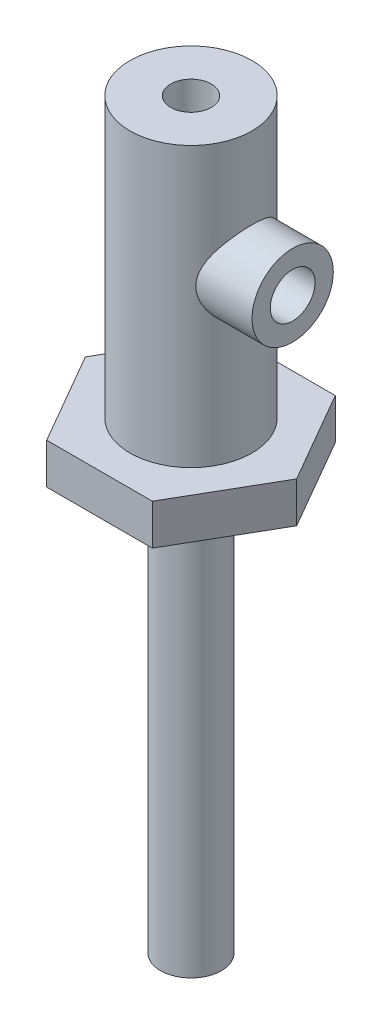
ISO-10303-21;
HEADER;
FILE_DESCRIPTION(('STEP AP214'),'2;1');
FILE_NAME('part.step','',(''),(''),'','','');
FILE_SCHEMA(('AUTOMOTIVE_DESIGN { 1 0 10303 214 1 1 1 1 }'));
ENDSEC;
DATA;
#1=APPLICATION_CONTEXT('core data for automotive mechanical design processes');
#2=APPLICATION_PROTOCOL_DEFINITION('international standard','automotive_design',2000,#1);
#3=PRODUCT_CONTEXT('',#1,'mechanical');
#4=PRODUCT('Part','Part','',(#3));
#5=PRODUCT_RELATED_PRODUCT_CATEGORY('part','',(#4));
#6=PRODUCT_DEFINITION_FORMATION('','',#4);
#7=PRODUCT_DEFINITION_CONTEXT('part definition',#1,'design');
#8=PRODUCT_DEFINITION('design','',#6,#7);
#9=PRODUCT_DEFINITION_SHAPE('','',#8);
#10=(LENGTH_UNIT() NAMED_UNIT(*) SI_UNIT(.MILLI.,.METRE.));
#11=(NAMED_UNIT(*) PLANE_ANGLE_UNIT() SI_UNIT($,.RADIAN.));
#12=(NAMED_UNIT(*) SI_UNIT($,.STERADIAN.) SOLID_ANGLE_UNIT());
#13=UNCERTAINTY_MEASURE_WITH_UNIT(LENGTH_MEASURE(1.E-05),#10,'distance_accuracy_value','');
#14=(GEOMETRIC_REPRESENTATION_CONTEXT(3) GLOBAL_UNCERTAINTY_ASSIGNED_CONTEXT((#13)) GLOBAL_UNIT_ASSIGNED_CONTEXT((#10,
#11,#12)) REPRESENTATION_CONTEXT('',''));
#15=CARTESIAN_POINT('',(0.,0.,0.));
#16=DIRECTION('',(0.,0.,1.));
#17=DIRECTION('',(1.,0.,0.));
#18=AXIS2_PLACEMENT_3D('',#15,#16,#17);
#19=CARTESIAN_POINT('',(0.,5.525,0.));
#20=DIRECTION('',(0.,1.,0.));
#21=DIRECTION('',(0.,0.,1.));
#22=AXIS2_PLACEMENT_3D('',#19,#20,#21);
#23=CYLINDRICAL_SURFACE('',#22,1.);
#24=CARTESIAN_POINT('',(0.,15.725,0.));
#25=DIRECTION('',(0.,1.,0.));
#26=DIRECTION('',(0.,0.,1.));
#27=AXIS2_PLACEMENT_3D('',#24,#25,#26);
#28=CIRCLE('',#27,1.);
#29=CARTESIAN_POINT('',(0.,15.725,1.));
#30=VERTEX_POINT('',#29);
#31=EDGE_CURVE('E170',#30,#30,#28,.T.);
#32=ORIENTED_EDGE('',*,*,#31,.T.);
#33=EDGE_LOOP('',(#32));
#34=FACE_BOUND('',#33,.T.);
#35=CARTESIAN_POINT('',(0.,5.525,0.));
#36=DIRECTION('',(0.,1.,0.));
#37=DIRECTION('',(0.,0.,1.));
#38=AXIS2_PLACEMENT_3D('',#35,#36,#37);
#39=CIRCLE('',#38,1.);
#40=CARTESIAN_POINT('',(0.,5.525,1.));
#41=VERTEX_POINT('',#40);
#42=EDGE_CURVE('E180',#41,#41,#39,.T.);
#43=ORIENTED_EDGE('',*,*,#42,.F.);
#44=EDGE_LOOP('',(#43));
#45=FACE_BOUND('',#44,.T.);
#46=DIRECTION('',(0.,1.,0.));
#47=VECTOR('',#46,1.);
#48=CARTESIAN_POINT('',(0.,5.525,-1.));
#49=LINE('',#48,#47);
#50=CARTESIAN_POINT('',(0.,10.1832575694956,-1.));
#51=VERTEX_POINT('',#50);
#52=CARTESIAN_POINT('',(0.,9.26674243050442,-1.));
#53=VERTEX_POINT('',#52);
#54=EDGE_CURVE('E11',#51,#53,#49,.F.);
#55=ORIENTED_EDGE('',*,*,#54,.F.);
#56=CARTESIAN_POINT('',(0.,10.1832575694956,-1.));
#57=CARTESIAN_POINT('',(0.0296201730521179,10.1831194419498,-1.00002996136619));
#58=CARTESIAN_POINT('',(0.0589749676990003,10.1861338633212,-0.99868732555389));
#59=CARTESIAN_POINT('',(0.116029285837842,10.1969389571791,-0.993641594933778));
#60=CARTESIAN_POINT('',(0.143749854801669,10.2046360138594,-0.989984710596634));
#61=CARTESIAN_POINT('',(0.21130907429664,10.2281546341324,-0.978298768916381));
#62=CARTESIAN_POINT('',(0.250132310892404,10.2461174400268,-0.968991638472719));
#63=CARTESIAN_POINT('',(0.324994392397176,10.2859041876652,-0.946531644316044));
#64=CARTESIAN_POINT('',(0.360995183033686,10.3077709969598,-0.933334900145696));
#65=CARTESIAN_POINT('',(0.426224607958811,10.3504109495733,-0.905226101100838));
#66=CARTESIAN_POINT('',(0.455747289954067,10.3710000073665,-0.890710437589105));
#67=CARTESIAN_POINT('',(0.513011709604824,10.4126018846491,-0.859005540690853));
#68=CARTESIAN_POINT('',(0.540752267615861,10.4336149729696,-0.84181456167265));
#69=CARTESIAN_POINT('',(0.621237078070059,10.496223662425,-0.786324518024733));
#70=CARTESIAN_POINT('',(0.671515129670791,10.5375790042774,-0.743990874288796));
#71=CARTESIAN_POINT('',(0.752879484416972,10.6061888291838,-0.660065937850455));
#72=CARTESIAN_POINT('',(0.785640051760052,10.6344046523304,-0.620869308529475));
#73=CARTESIAN_POINT('',(0.845746157339784,10.6868037750584,-0.536100466077223));
#74=CARTESIAN_POINT('',(0.873098953085571,10.7109924722677,-0.49053693984766));
#75=CARTESIAN_POINT('',(0.916170153682461,10.7493503677566,-0.403125341022513));
#76=CARTESIAN_POINT('',(0.933120657535419,10.7645555776252,-0.362343284324251));
#77=CARTESIAN_POINT('',(0.961745542419179,10.7903239714841,-0.277564592099852));
#78=CARTESIAN_POINT('',(0.973423413521915,10.8008902259731,-0.23357010542594));
#79=CARTESIAN_POINT('',(0.990776475957356,10.8166155306831,-0.143151077309976));
#80=CARTESIAN_POINT('',(0.996413409257956,10.8217401162732,-0.0967129794800645));
#81=CARTESIAN_POINT('',(1.00108763494418,10.8259883523368,-0.00323490952425844));
#82=CARTESIAN_POINT('',(1.00012736092908,10.8251142156386,0.0438048342738349));
#83=CARTESIAN_POINT('',(0.992132957980567,10.8178520574469,0.132037237698455));
#84=CARTESIAN_POINT('',(0.985727011445585,10.8120343287992,0.173337698440637));
#85=CARTESIAN_POINT('',(0.96808341495657,10.7960609384214,0.254008552341759));
#86=CARTESIAN_POINT('',(0.956844836815365,10.7859044433616,0.293378573108546));
#87=CARTESIAN_POINT('',(0.929467726954121,10.7612781856954,0.37132366876728));
#88=CARTESIAN_POINT('',(0.913113207059213,10.7466189483322,0.409761712376257));
#89=CARTESIAN_POINT('',(0.876478928518945,10.7140127960909,0.483188449254017));
#90=CARTESIAN_POINT('',(0.856197571454796,10.6960645425787,0.518175729106231));
#91=CARTESIAN_POINT('',(0.800807900114322,10.6475121495769,0.601990334947999));
#92=CARTESIAN_POINT('',(0.763515519731663,10.6152202587814,0.64840487431778));
#93=CARTESIAN_POINT('',(0.682928749831262,10.5471468227738,0.732826125183259));
#94=CARTESIAN_POINT('',(0.63961467899611,10.5113539535413,0.770804160026089));
#95=CARTESIAN_POINT('',(0.546687138885316,10.4377491266718,0.839379168685292));
#96=CARTESIAN_POINT('',(0.496946573123861,10.3999092676383,0.869775240989043));
#97=CARTESIAN_POINT('',(0.417992944968771,10.3449779855255,0.90892143257758));
#98=CARTESIAN_POINT('',(0.390965540831524,10.3269806592514,0.920891232795006));
#99=CARTESIAN_POINT('',(0.335214930173243,10.2923516660499,0.942616728372639));
#100=CARTESIAN_POINT('',(0.306493891029926,10.2757183161295,0.952375179342418));
#101=CARTESIAN_POINT('',(0.250086185492186,10.2465570754136,0.968621610146145));
#102=CARTESIAN_POINT('',(0.222597094673131,10.2337828672684,0.975342769709289));
#103=CARTESIAN_POINT('',(0.165952038648769,10.2116920625624,0.986551635924468));
#104=CARTESIAN_POINT('',(0.136808294424197,10.2023531662678,0.991053814029712));
#105=CARTESIAN_POINT('',(0.089546787792336,10.191620021923,0.99613572372635));
#106=CARTESIAN_POINT('',(0.0719079945476507,10.1885366853055,0.997568347968726));
#107=CARTESIAN_POINT('',(0.036192235783711,10.1843314019562,0.999508122894015));
#108=CARTESIAN_POINT('',(0.0181127639440912,10.1832272170659,1.00000689450016));
#109=CARTESIAN_POINT('',(0.,10.1832575694956,1.));
#110=B_SPLINE_CURVE_WITH_KNOTS('',3,(#56,#57,#58,#59,#60,#61,#62,#63,#64,#65,#66,#67,#68,#69,
#70,#71,#72,#73,#74,#75,#76,#77,#78,#79,#80,#81,#82,#83,#84,#85,#86,#87,#88,#89,#90,#91,#92,#93,
#94,#95,#96,#97,#98,#99,#100,#101,#102,#103,#104,#105,#106,#107,#108,#109),.UNSPECIFIED.,.F.,
.F.,(4,2,2,2,2,2,2,2,2,2,2,2,2,2,2,2,2,2,2,2,2,2,2,2,2,2,4),(0.,0.0882599879334335,
0.174810942316959,0.305425171900667,0.437573328498414,0.553849610259005,0.670202082375697,
0.901865237705392,1.07636170641697,1.25062237800182,1.39019273093231,1.52967056323947,
1.67002659909901,1.81033086274846,1.9363541123972,2.06240157772333,2.19472095998222,
2.32709431650133,2.52916810463126,2.73191859757464,2.93957649648164,3.04330410405431,
3.14690173481388,3.2398412432332,3.33216633521675,3.38592919900724,3.44017218514929),.UNSPECIFIED.);
#111=CARTESIAN_POINT('',(0.,10.1832575694956,1.));
#112=VERTEX_POINT('',#111);
#113=EDGE_CURVE('E260',#51,#112,#110,.T.);
#114=ORIENTED_EDGE('',*,*,#113,.T.);
#115=DIRECTION('',(0.,1.,0.));
#116=VECTOR('',#115,1.);
#117=CARTESIAN_POINT('',(0.,5.525,1.));
#118=LINE('',#117,#116);
#119=CARTESIAN_POINT('',(0.,9.26674243050442,1.));
#120=VERTEX_POINT('',#119);
#121=EDGE_CURVE('E49',#120,#112,#118,.T.);
#122=ORIENTED_EDGE('',*,*,#121,.F.);
#123=CARTESIAN_POINT('',(0.,9.26674243050442,1.));
#124=CARTESIAN_POINT('',(0.0296201730521181,9.26688055805021,1.00002996136619));
#125=CARTESIAN_POINT('',(0.0589749676990005,9.26386613667879,0.99868732555389));
#126=CARTESIAN_POINT('',(0.116029285837842,9.25306104282093,0.993641594933778));
#127=CARTESIAN_POINT('',(0.143749854801669,9.24536398614058,0.989984710596634));
#128=CARTESIAN_POINT('',(0.21130907429664,9.22184536586763,0.978298768916381));
#129=CARTESIAN_POINT('',(0.250132310892404,9.2038825599732,0.968991638472719));
#130=CARTESIAN_POINT('',(0.324994392397176,9.16409581233475,0.946531644316044));
#131=CARTESIAN_POINT('',(0.360995183033686,9.14222900304022,0.933334900145696));
#132=CARTESIAN_POINT('',(0.426224607958811,9.09958905042668,0.905226101100838));
#133=CARTESIAN_POINT('',(0.455747289954067,9.07899999263349,0.890710437589105));
#134=CARTESIAN_POINT('',(0.513011709604824,9.03739811535086,0.859005540690853));
#135=CARTESIAN_POINT('',(0.540752267615861,9.01638502703042,0.84181456167265));
#136=CARTESIAN_POINT('',(0.621237078070059,8.95377633757499,0.786324518024733));
#137=CARTESIAN_POINT('',(0.671515129670791,8.91242099572261,0.743990874288796));
#138=CARTESIAN_POINT('',(0.752879484416972,8.8438111708162,0.660065937850455));
#139=CARTESIAN_POINT('',(0.785640051760052,8.81559534766963,0.620869308529475));
#140=CARTESIAN_POINT('',(0.845746157339784,8.76319622494157,0.536100466077223));
#141=CARTESIAN_POINT('',(0.873098953085571,8.7390075277323,0.49053693984766));
#142=CARTESIAN_POINT('',(0.916170153682461,8.7006496322434,0.403125341022513));
#143=CARTESIAN_POINT('',(0.933120657535419,8.68544442237484,0.362343284324251));
#144=CARTESIAN_POINT('',(0.961745542419179,8.65967602851587,0.277564592099852));
#145=CARTESIAN_POINT('',(0.973423413521915,8.64910977402689,0.23357010542594));
#146=CARTESIAN_POINT('',(0.990776475957356,8.6333844693169,0.143151077309976));
#147=CARTESIAN_POINT('',(0.996413409257956,8.62825988372681,0.0967129794800645));
#148=CARTESIAN_POINT('',(1.00108763494418,8.62401164766319,0.00323490952425845));
#149=CARTESIAN_POINT('',(1.00012736092908,8.62488578436135,-0.0438048342738349));
#150=CARTESIAN_POINT('',(0.992132957980567,8.63214794255315,-0.132037237698455));
#151=CARTESIAN_POINT('',(0.985727011445585,8.63796567120084,-0.173337698440638));
#152=CARTESIAN_POINT('',(0.96808341495657,8.6539390615786,-0.254008552341759));
#153=CARTESIAN_POINT('',(0.956844836815365,8.66409555663837,-0.293378573108546));
#154=CARTESIAN_POINT('',(0.929467726954121,8.68872181430457,-0.37132366876728));
#155=CARTESIAN_POINT('',(0.913113207059213,8.70338105166776,-0.409761712376257));
#156=CARTESIAN_POINT('',(0.876478928518945,8.73598720390915,-0.483188449254017));
#157=CARTESIAN_POINT('',(0.856197571454796,8.75393545742128,-0.518175729106231));
#158=CARTESIAN_POINT('',(0.800807900114322,8.80248785042315,-0.601990334947999));
#159=CARTESIAN_POINT('',(0.763515519731663,8.83477974121861,-0.64840487431778));
#160=CARTESIAN_POINT('',(0.682928749831262,8.90285317722618,-0.732826125183259));
#161=CARTESIAN_POINT('',(0.63961467899611,8.93864604645866,-0.770804160026089));
#162=CARTESIAN_POINT('',(0.546687138885317,9.01225087332822,-0.839379168685291));
#163=CARTESIAN_POINT('',(0.496946573123862,9.0500907323617,-0.869775240989043));
#164=CARTESIAN_POINT('',(0.417992944968772,9.10502201447449,-0.90892143257758));
#165=CARTESIAN_POINT('',(0.390965540831525,9.12301934074864,-0.920891232795006));
#166=CARTESIAN_POINT('',(0.335214930173243,9.15764833395008,-0.942616728372639));
#167=CARTESIAN_POINT('',(0.306493891029926,9.17428168387049,-0.952375179342418));
#168=CARTESIAN_POINT('',(0.250086185492186,9.20344292458639,-0.968621610146145));
#169=CARTESIAN_POINT('',(0.222597094673131,9.21621713273163,-0.975342769709289));
#170=CARTESIAN_POINT('',(0.165952038648769,9.23830793743762,-0.986551635924468));
#171=CARTESIAN_POINT('',(0.136808294424197,9.24764683373223,-0.991053814029712));
#172=CARTESIAN_POINT('',(0.089546787792336,9.25837997807698,-0.99613572372635));
#173=CARTESIAN_POINT('',(0.0719079945476507,9.26146331469451,-0.997568347968726));
#174=CARTESIAN_POINT('',(0.036192235783711,9.26566859804375,-0.999508122894015));
#175=CARTESIAN_POINT('',(0.0181127639440912,9.26677278293412,-1.00000689450016));
#176=CARTESIAN_POINT('',(0.,9.26674243050441,-1.));
#177=B_SPLINE_CURVE_WITH_KNOTS('',3,(#123,#124,#125,#126,#127,#128,#129,#130,#131,#132,#133,
#134,#135,#136,#137,#138,#139,#140,#141,#142,#143,#144,#145,#146,#147,#148,#149,#150,#151,#152,
#153,#154,#155,#156,#157,#158,#159,#160,#161,#162,#163,#164,#165,#166,#167,#168,#169,#170,#171,
#172,#173,#174,#175,#176),.UNSPECIFIED.,.F.,.F.,(4,2,2,2,2,2,2,2,2,2,2,2,2,2,2,2,2,2,2,2,2,2,2,
2,2,2,4),(0.,0.0882599879334338,0.174810942316959,0.305425171900667,0.437573328498414,
0.553849610259005,0.670202082375697,0.901865237705392,1.07636170641697,1.25062237800182,
1.39019273093231,1.52967056323947,1.67002659909901,1.81033086274846,1.9363541123972,
2.06240157772333,2.19472095998222,2.32709431650133,2.52916810463127,2.73191859757465,
2.93957649648164,3.04330410405431,3.14690173481388,3.2398412432332,3.33216633521675,
3.38592919900724,3.44017218514929),.UNSPECIFIED.);
#178=EDGE_CURVE('E252',#120,#53,#177,.T.);
#179=ORIENTED_EDGE('',*,*,#178,.T.);
#180=EDGE_LOOP('',(#55,#114,#122,#179));
#181=FACE_BOUND('',#180,.T.);
#182=ADVANCED_FACE('F39',(#34,#45,#181),#23,.F.);
#183=CARTESIAN_POINT('',(0.,15.725,0.));
#184=DIRECTION('',(0.,-1.,0.));
#185=DIRECTION('',(0.,0.,-1.));
#186=AXIS2_PLACEMENT_3D('',#183,#184,#185);
#187=CYLINDRICAL_SURFACE('',#186,3.);
#188=CARTESIAN_POINT('',(2.23606797749979,9.725,-2.));
#189=CARTESIAN_POINT('',(2.23607753462817,9.62737168913138,-1.99999453997731));
#190=CARTESIAN_POINT('',(2.24258071047442,9.5297092462912,-1.99278992503664));
#191=CARTESIAN_POINT('',(2.26731972501617,9.33788008834918,-1.96458268317731));
#192=CARTESIAN_POINT('',(2.2855766081271,9.24371996447043,-1.94355530587862));
#193=CARTESIAN_POINT('',(2.3305658582557,9.06226455812231,-1.88935861676632));
#194=CARTESIAN_POINT('',(2.35721561794602,8.97491230326234,-1.85630718014214));
#195=CARTESIAN_POINT('',(2.41584094681825,8.80713416765333,-1.77934008393538));
#196=CARTESIAN_POINT('',(2.44781762158831,8.72670973002353,-1.73542216812163));
#197=CARTESIAN_POINT('',(2.51946072932026,8.56135311238309,-1.63002410007714));
#198=CARTESIAN_POINT('',(2.55954936090364,8.4776678822828,-1.56687435451732));
#199=CARTESIAN_POINT('',(2.63944827308083,8.32099729112571,-1.4281921974068));
#200=CARTESIAN_POINT('',(2.67925824297985,8.24802247834147,-1.3526477317708));
#201=CARTESIAN_POINT('',(2.76088818523747,8.10435634121833,-1.17815690494295));
#202=CARTESIAN_POINT('',(2.80216785846923,8.03551748822433,-1.07740643965819));
#203=CARTESIAN_POINT('',(2.87558484482764,7.91635790450992,-0.862470964212228));
#204=CARTESIAN_POINT('',(2.90773236231037,7.86601648596881,-0.7483011523217));
#205=CARTESIAN_POINT('',(2.95599907464725,7.79144359898255,-0.52324907348));
#206=CARTESIAN_POINT('',(2.97351175615867,7.76491665550444,-0.413434725181413));
#207=CARTESIAN_POINT('',(2.99609745461921,7.73081551071635,-0.189695448729859));
#208=CARTESIAN_POINT('',(3.00118613762359,7.72321744077456,-0.0757758812858226));
#209=CARTESIAN_POINT('',(2.99855361722953,7.72717244994905,0.134147050232332));
#210=CARTESIAN_POINT('',(2.99266264910127,7.73598905131706,0.230240638008755));
#211=CARTESIAN_POINT('',(2.9720818279002,7.76709105135891,0.419238633271017));
#212=CARTESIAN_POINT('',(2.95739133313102,7.78937743230354,0.512142807649726));
#213=CARTESIAN_POINT('',(2.92052091703736,7.84619568479458,0.692077937671171));
#214=CARTESIAN_POINT('',(2.89837077982679,7.88067888519856,0.779130623845963));
#215=CARTESIAN_POINT('',(2.84821104476287,7.96055364295282,0.946209150653557));
#216=CARTESIAN_POINT('',(2.82020037745161,8.00594719150151,1.0262337049694));
#217=CARTESIAN_POINT('',(2.75618058450702,8.11297873745989,1.18828429196344));
#218=CARTESIAN_POINT('',(2.71960408792025,8.17596752335279,1.26919148099708));
#219=CARTESIAN_POINT('',(2.64400601826998,8.31289867948032,1.41998807498305));
#220=CARTESIAN_POINT('',(2.60498072815232,8.38685794593381,1.48986013519457));
#221=CARTESIAN_POINT('',(2.52150044944151,8.55696321021329,1.62772235326165));
#222=CARTESIAN_POINT('',(2.47714320008931,8.65477107971449,1.69373593126354));
#223=CARTESIAN_POINT('',(2.39475610831095,8.86250983922072,1.80834874945483));
#224=CARTESIAN_POINT('',(2.3567157153489,8.9724199944139,1.85697718654898));
#225=CARTESIAN_POINT('',(2.30262870306889,9.1697190620731,1.92332724567776));
#226=CARTESIAN_POINT('',(2.28340364577667,9.25459337005688,1.94590791747533));
#227=CARTESIAN_POINT('',(2.25409039789612,9.42803948981684,1.97979555580014));
#228=CARTESIAN_POINT('',(2.24398636782354,9.51660461117262,1.99112206964395));
#229=CARTESIAN_POINT('',(2.23447556987372,9.6954429864415,2.00179400148877));
#230=CARTESIAN_POINT('',(2.2351153386647,9.78572197852013,2.00108729753098));
#231=CARTESIAN_POINT('',(2.24709880368953,9.96468383395505,1.98761629716365));
#232=CARTESIAN_POINT('',(2.25845117648851,10.0533653441074,1.97484222690381));
#233=CARTESIAN_POINT('',(2.28927977500747,10.2223894175498,1.93899811187046));
#234=CARTESIAN_POINT('',(2.30833187069749,10.3029277090026,1.91646174529973));
#235=CARTESIAN_POINT('',(2.35229958533651,10.4591262360503,1.86223041628513));
#236=CARTESIAN_POINT('',(2.3772171729463,10.534784822963,1.83053237805351));
#237=CARTESIAN_POINT('',(2.43611483596194,10.6952020038475,1.75163346599563));
#238=CARTESIAN_POINT('',(2.47091081434316,10.7787568115427,1.70260028818246));
#239=CARTESIAN_POINT('',(2.54262514806634,10.9374168026173,1.59352731501438));
#240=CARTESIAN_POINT('',(2.57954604947543,11.0125115167425,1.53347411883827));
#241=CARTESIAN_POINT('',(2.66075678321007,11.1689623474675,1.38876657712435));
#242=CARTESIAN_POINT('',(2.70489452138573,11.2481028482483,1.30160386514207));
#243=CARTESIAN_POINT('',(2.78775581841638,11.3908166829403,1.11309948866219));
#244=CARTESIAN_POINT('',(2.82648414789457,11.4544037712567,1.011770477457));
#245=CARTESIAN_POINT('',(2.88790821242222,11.5528917389176,0.817487474821795));
#246=CARTESIAN_POINT('',(2.91225458111008,11.5909565044404,0.726662364886319));
#247=CARTESIAN_POINT('',(2.95278707867041,11.6536071943204,0.538757079020513));
#248=CARTESIAN_POINT('',(2.96898009871993,11.6782045028598,0.441682263858767));
#249=CARTESIAN_POINT('',(2.99178364026746,11.7126969638388,0.243369392303441));
#250=CARTESIAN_POINT('',(2.99835150856533,11.7225266795067,0.142114836924316));
#251=CARTESIAN_POINT('',(3.00109821029056,11.7266478514171,-0.0608555465807337));
#252=CARTESIAN_POINT('',(2.99727800938901,11.7209407519562,-0.162571330953449));
#253=CARTESIAN_POINT('',(2.98029555977323,11.6953405109953,-0.355757532528107));
#254=CARTESIAN_POINT('',(2.96783277209856,11.6765090151382,-0.447435143070531));
#255=CARTESIAN_POINT('',(2.93536106206933,11.6267619905691,-0.626018422997063));
#256=CARTESIAN_POINT('',(2.91535096747103,11.5958445846527,-0.712923348686891));
#257=CARTESIAN_POINT('',(2.86791765486194,11.521061295116,-0.885147296608352));
#258=CARTESIAN_POINT('',(2.84013248946338,11.4765496925049,-0.970083589200267));
#259=CARTESIAN_POINT('',(2.77975408235472,11.376849355374,-1.13155266268318));
#260=CARTESIAN_POINT('',(2.74715796645263,11.321654232048,-1.20808037205002));
#261=CARTESIAN_POINT('',(2.67392931472394,11.1923710976637,-1.36329422201402));
#262=CARTESIAN_POINT('',(2.6328391387737,11.116676976326,-1.44042679526091));
#263=CARTESIAN_POINT('',(2.55053357649486,10.9538864584542,-1.58160022281596));
#264=CARTESIAN_POINT('',(2.50931811970154,10.8667816111659,-1.64563128323923));
#265=CARTESIAN_POINT('',(2.43384213590298,10.6891324092447,-1.75513253518411));
#266=CARTESIAN_POINT('',(2.39929086741904,10.5993581900497,-1.8016464689721));
#267=CARTESIAN_POINT('',(2.33747501591022,10.4117155510068,-1.88115802340273));
#268=CARTESIAN_POINT('',(2.31019631295305,10.3138633061378,-1.91418190281333));
#269=CARTESIAN_POINT('',(2.27191051929539,10.1342285315754,-1.95936262470908));
#270=CARTESIAN_POINT('',(2.25863695410151,10.0536917632097,-1.97452228373248));
#271=CARTESIAN_POINT('',(2.24071519216009,9.89044359949546,-1.99483915818926));
#272=CARTESIAN_POINT('',(2.23605987841475,9.80773405573942,-2.00000462703715));
#273=CARTESIAN_POINT('',(2.23606797749979,9.725,-2.));
#274=B_SPLINE_CURVE_WITH_KNOTS('',3,(#188,#189,#190,#191,#192,#193,#194,#195,#196,#197,#198,
#199,#200,#201,#202,#203,#204,#205,#206,#207,#208,#209,#210,#211,#212,#213,#214,#215,#216,#217,
#218,#219,#220,#221,#222,#223,#224,#225,#226,#227,#228,#229,#230,#231,#232,#233,#234,#235,#236,
#237,#238,#239,#240,#241,#242,#243,#244,#245,#246,#247,#248,#249,#250,#251,#252,#253,#254,#255,
#256,#257,#258,#259,#260,#261,#262,#263,#264,#265,#266,#267,#268,#269,#270,#271,#272,#273),
.UNSPECIFIED.,.T.,.F.,(4,2,2,2,2,2,2,2,2,2,2,2,2,2,2,2,2,2,2,2,2,2,2,2,2,2,2,2,2,2,2,2,2,2,2,2,
2,2,2,2,2,2,4),(0.,0.292506930722155,0.58553904225929,0.875772651216274,1.16606657266549,
1.50154677068638,1.83735518436276,2.2216703100629,2.6055542938858,2.9463748206358,
3.28676536688298,3.57539534955742,3.86404638283746,4.15155831973191,4.43912276903,
4.76447525946635,5.09033414796638,5.46678703504944,5.84260469743948,6.11126090401325,
6.37944966235486,6.64880037638036,6.91836943570598,7.17476451706936,7.43124577644957,
7.73899230052352,8.04711556801509,8.42254684520963,8.79764490572581,9.10070580611698,
9.40351012888472,9.70765229266165,10.0117661844615,10.2937678224973,10.5758132789284,
10.874178629859,11.1727229593109,11.5182220628451,11.863978504186,12.1833412579672,
12.5020793664923,12.7501661630426,12.9980479966543),.UNSPECIFIED.);
#275=CARTESIAN_POINT('',(2.23606797749979,9.725,-2.));
#276=VERTEX_POINT('',#275);
#277=EDGE_CURVE('E196',#276,#276,#274,.T.);
#278=ORIENTED_EDGE('',*,*,#277,.T.);
#279=EDGE_LOOP('',(#278));
#280=FACE_BOUND('',#279,.T.);
#281=CARTESIAN_POINT('',(0.,15.725,0.));
#282=DIRECTION('',(0.,1.,0.));
#283=DIRECTION('',(0.,0.,1.));
#284=AXIS2_PLACEMENT_3D('',#281,#282,#283);
#285=CIRCLE('',#284,3.);
#286=CARTESIAN_POINT('',(0.,15.725,3.));
#287=VERTEX_POINT('',#286);
#288=EDGE_CURVE('E184',#287,#287,#285,.T.);
#289=ORIENTED_EDGE('',*,*,#288,.F.);
#290=EDGE_LOOP('',(#289));
#291=FACE_BOUND('',#290,.T.);
#292=CARTESIAN_POINT('',(0.,2.,0.));
#293=DIRECTION('',(0.,-1.,0.));
#294=DIRECTION('',(0.,0.,-1.));
#295=AXIS2_PLACEMENT_3D('',#292,#293,#294);
#296=CIRCLE('',#295,3.);
#297=CARTESIAN_POINT('',(0.,2.,-3.));
#298=VERTEX_POINT('',#297);
#299=EDGE_CURVE('E191',#298,#298,#296,.T.);
#300=ORIENTED_EDGE('',*,*,#299,.F.);
#301=EDGE_LOOP('',(#300));
#302=FACE_BOUND('',#301,.T.);
#303=ADVANCED_FACE('F41',(#280,#291,#302),#187,.T.);
#304=CARTESIAN_POINT('',(0.,15.725,0.));
#305=DIRECTION('',(0.,1.,0.));
#306=DIRECTION('',(0.,0.,1.));
#307=AXIS2_PLACEMENT_3D('',#304,#305,#306);
#308=PLANE('',#307);
#309=ORIENTED_EDGE('',*,*,#31,.F.);
#310=EDGE_LOOP('',(#309));
#311=FACE_BOUND('',#310,.T.);
#312=ORIENTED_EDGE('',*,*,#288,.T.);
#313=EDGE_LOOP('',(#312));
#314=FACE_BOUND('',#313,.T.);
#315=ADVANCED_FACE('F244',(#311,#314),#308,.T.);
#316=CARTESIAN_POINT('',(0.,5.525,0.));
#317=DIRECTION('',(0.,1.,0.));
#318=DIRECTION('',(0.,0.,1.));
#319=AXIS2_PLACEMENT_3D('',#316,#317,#318);
#320=PLANE('',#319);
#321=ORIENTED_EDGE('',*,*,#42,.T.);
#322=EDGE_LOOP('',(#321));
#323=FACE_BOUND('',#322,.T.);
#324=ADVANCED_FACE('F241',(#323),#320,.T.);
#325=CARTESIAN_POINT('',(-2.59807621135332,2.,4.5));
#326=DIRECTION('',(-0.866025403784439,0.,0.5));
#327=DIRECTION('',(0.5,0.,0.866025403784439));
#328=AXIS2_PLACEMENT_3D('',#325,#326,#327);
#329=PLANE('',#328);
#330=DIRECTION('',(-0.5,0.,-0.866025403784439));
#331=VECTOR('',#330,1.);
#332=CARTESIAN_POINT('',(-2.59807621135332,0.,4.5));
#333=LINE('',#332,#331);
#334=CARTESIAN_POINT('',(-2.59807621135332,0.,4.5));
#335=VERTEX_POINT('',#334);
#336=CARTESIAN_POINT('',(-5.19615242270663,0.,0.));
#337=VERTEX_POINT('',#336);
#338=EDGE_CURVE('E145',#335,#337,#333,.T.);
#339=ORIENTED_EDGE('',*,*,#338,.F.);
#340=DIRECTION('',(0.,-1.,0.));
#341=VECTOR('',#340,1.);
#342=CARTESIAN_POINT('',(-2.59807621135332,2.,4.5));
#343=LINE('',#342,#341);
#344=CARTESIAN_POINT('',(-2.59807621135332,2.,4.5));
#345=VERTEX_POINT('',#344);
#346=EDGE_CURVE('E64',#345,#335,#343,.T.);
#347=ORIENTED_EDGE('',*,*,#346,.F.);
#348=DIRECTION('',(-0.5,0.,-0.866025403784439));
#349=VECTOR('',#348,1.);
#350=CARTESIAN_POINT('',(-2.59807621135332,2.,4.5));
#351=LINE('',#350,#349);
#352=CARTESIAN_POINT('',(-5.19615242270663,2.,0.));
#353=VERTEX_POINT('',#352);
#354=EDGE_CURVE('E167',#345,#353,#351,.T.);
#355=ORIENTED_EDGE('',*,*,#354,.T.);
#356=DIRECTION('',(0.,-1.,0.));
#357=VECTOR('',#356,1.);
#358=CARTESIAN_POINT('',(-5.19615242270663,2.,0.));
#359=LINE('',#358,#357);
#360=EDGE_CURVE('E97',#353,#337,#359,.T.);
#361=ORIENTED_EDGE('',*,*,#360,.T.);
#362=EDGE_LOOP('',(#339,#347,#355,#361));
#363=FACE_BOUND('',#362,.T.);
#364=ADVANCED_FACE('F228',(#363),#329,.T.);
#365=CARTESIAN_POINT('',(2.59807621135332,2.,4.5));
#366=DIRECTION('',(0.,0.,1.));
#367=DIRECTION('',(1.,0.,0.));
#368=AXIS2_PLACEMENT_3D('',#365,#366,#367);
#369=PLANE('',#368);
#370=DIRECTION('',(-1.,0.,0.));
#371=VECTOR('',#370,1.);
#372=CARTESIAN_POINT('',(2.59807621135332,0.,4.5));
#373=LINE('',#372,#371);
#374=CARTESIAN_POINT('',(2.59807621135332,0.,4.5));
#375=VERTEX_POINT('',#374);
#376=EDGE_CURVE('E163',#375,#335,#373,.T.);
#377=ORIENTED_EDGE('',*,*,#376,.F.);
#378=DIRECTION('',(0.,-1.,0.));
#379=VECTOR('',#378,1.);
#380=CARTESIAN_POINT('',(2.59807621135332,2.,4.5));
#381=LINE('',#380,#379);
#382=CARTESIAN_POINT('',(2.59807621135332,2.,4.5));
#383=VERTEX_POINT('',#382);
#384=EDGE_CURVE('E122',#383,#375,#381,.T.);
#385=ORIENTED_EDGE('',*,*,#384,.F.);
#386=DIRECTION('',(-1.,0.,0.));
#387=VECTOR('',#386,1.);
#388=CARTESIAN_POINT('',(2.59807621135332,2.,4.5));
#389=LINE('',#388,#387);
#390=EDGE_CURVE('E131',#383,#345,#389,.T.);
#391=ORIENTED_EDGE('',*,*,#390,.T.);
#392=ORIENTED_EDGE('',*,*,#346,.T.);
#393=EDGE_LOOP('',(#377,#385,#391,#392));
#394=FACE_BOUND('',#393,.T.);
#395=ADVANCED_FACE('F225',(#394),#369,.T.);
#396=CARTESIAN_POINT('',(5.19615242270663,2.,0.));
#397=DIRECTION('',(0.866025403784438,0.,0.5));
#398=DIRECTION('',(0.5,0.,-0.866025403784439));
#399=AXIS2_PLACEMENT_3D('',#396,#397,#398);
#400=PLANE('',#399);
#401=DIRECTION('',(-0.5,0.,0.866025403784438));
#402=VECTOR('',#401,1.);
#403=CARTESIAN_POINT('',(5.19615242270663,0.,0.));
#404=LINE('',#403,#402);
#405=CARTESIAN_POINT('',(5.19615242270663,0.,0.));
#406=VERTEX_POINT('',#405);
#407=EDGE_CURVE('E116',#406,#375,#404,.T.);
#408=ORIENTED_EDGE('',*,*,#407,.F.);
#409=DIRECTION('',(0.,-1.,0.));
#410=VECTOR('',#409,1.);
#411=CARTESIAN_POINT('',(5.19615242270663,2.,0.));
#412=LINE('',#411,#410);
#413=CARTESIAN_POINT('',(5.19615242270663,2.,0.));
#414=VERTEX_POINT('',#413);
#415=EDGE_CURVE('E110',#414,#406,#412,.T.);
#416=ORIENTED_EDGE('',*,*,#415,.F.);
#417=DIRECTION('',(-0.5,0.,0.866025403784438));
#418=VECTOR('',#417,1.);
#419=CARTESIAN_POINT('',(5.19615242270663,2.,0.));
#420=LINE('',#419,#418);
#421=EDGE_CURVE('E113',#414,#383,#420,.T.);
#422=ORIENTED_EDGE('',*,*,#421,.T.);
#423=ORIENTED_EDGE('',*,*,#384,.T.);
#424=EDGE_LOOP('',(#408,#416,#422,#423));
#425=FACE_BOUND('',#424,.T.);
#426=ADVANCED_FACE('F112',(#425),#400,.T.);
#427=CARTESIAN_POINT('',(2.59807621135332,2.,-4.5));
#428=DIRECTION('',(0.866025403784439,0.,-0.5));
#429=DIRECTION('',(-0.5,0.,-0.866025403784439));
#430=AXIS2_PLACEMENT_3D('',#427,#428,#429);
#431=PLANE('',#430);
#432=DIRECTION('',(0.5,0.,0.866025403784439));
#433=VECTOR('',#432,1.);
#434=CARTESIAN_POINT('',(2.59807621135332,0.,-4.5));
#435=LINE('',#434,#433);
#436=CARTESIAN_POINT('',(2.59807621135332,0.,-4.5));
#437=VERTEX_POINT('',#436);
#438=EDGE_CURVE('E158',#437,#406,#435,.T.);
#439=ORIENTED_EDGE('',*,*,#438,.F.);
#440=DIRECTION('',(0.,-1.,0.));
#441=VECTOR('',#440,1.);
#442=CARTESIAN_POINT('',(2.59807621135332,2.,-4.5));
#443=LINE('',#442,#441);
#444=CARTESIAN_POINT('',(2.59807621135332,2.,-4.5));
#445=VERTEX_POINT('',#444);
#446=EDGE_CURVE('E123',#445,#437,#443,.T.);
#447=ORIENTED_EDGE('',*,*,#446,.F.);
#448=DIRECTION('',(0.5,0.,0.866025403784439));
#449=VECTOR('',#448,1.);
#450=CARTESIAN_POINT('',(2.59807621135332,2.,-4.5));
#451=LINE('',#450,#449);
#452=EDGE_CURVE('E129',#445,#414,#451,.T.);
#453=ORIENTED_EDGE('',*,*,#452,.T.);
#454=ORIENTED_EDGE('',*,*,#415,.T.);
#455=EDGE_LOOP('',(#439,#447,#453,#454));
#456=FACE_BOUND('',#455,.T.);
#457=ADVANCED_FACE('F134',(#456),#431,.T.);
#458=CARTESIAN_POINT('',(-2.59807621135332,2.,-4.5));
#459=DIRECTION('',(0.,0.,-1.));
#460=DIRECTION('',(-1.,0.,0.));
#461=AXIS2_PLACEMENT_3D('',#458,#459,#460);
#462=PLANE('',#461);
#463=DIRECTION('',(1.,0.,0.));
#464=VECTOR('',#463,1.);
#465=CARTESIAN_POINT('',(-2.59807621135332,0.,-4.5));
#466=LINE('',#465,#464);
#467=CARTESIAN_POINT('',(-2.59807621135332,0.,-4.5));
#468=VERTEX_POINT('',#467);
#469=EDGE_CURVE('E154',#468,#437,#466,.T.);
#470=ORIENTED_EDGE('',*,*,#469,.F.);
#471=DIRECTION('',(0.,-1.,0.));
#472=VECTOR('',#471,1.);
#473=CARTESIAN_POINT('',(-2.59807621135332,2.,-4.5));
#474=LINE('',#473,#472);
#475=CARTESIAN_POINT('',(-2.59807621135332,2.,-4.5));
#476=VERTEX_POINT('',#475);
#477=EDGE_CURVE('E175',#476,#468,#474,.T.);
#478=ORIENTED_EDGE('',*,*,#477,.F.);
#479=DIRECTION('',(1.,0.,0.));
#480=VECTOR('',#479,1.);
#481=CARTESIAN_POINT('',(-2.59807621135332,2.,-4.5));
#482=LINE('',#481,#480);
#483=EDGE_CURVE('E136',#476,#445,#482,.T.);
#484=ORIENTED_EDGE('',*,*,#483,.T.);
#485=ORIENTED_EDGE('',*,*,#446,.T.);
#486=EDGE_LOOP('',(#470,#478,#484,#485));
#487=FACE_BOUND('',#486,.T.);
#488=ADVANCED_FACE('F233',(#487),#462,.T.);
#489=CARTESIAN_POINT('',(-5.19615242270663,2.,0.));
#490=DIRECTION('',(-0.866025403784439,0.,-0.5));
#491=DIRECTION('',(-0.5,0.,0.866025403784439));
#492=AXIS2_PLACEMENT_3D('',#489,#490,#491);
#493=PLANE('',#492);
#494=DIRECTION('',(0.5,0.,-0.866025403784439));
#495=VECTOR('',#494,1.);
#496=CARTESIAN_POINT('',(-5.19615242270663,0.,0.));
#497=LINE('',#496,#495);
#498=EDGE_CURVE('E149',#337,#468,#497,.T.);
#499=ORIENTED_EDGE('',*,*,#498,.F.);
#500=ORIENTED_EDGE('',*,*,#360,.F.);
#501=DIRECTION('',(0.5,0.,-0.866025403784439));
#502=VECTOR('',#501,1.);
#503=CARTESIAN_POINT('',(-5.19615242270663,2.,0.));
#504=LINE('',#503,#502);
#505=EDGE_CURVE('E139',#353,#476,#504,.T.);
#506=ORIENTED_EDGE('',*,*,#505,.T.);
#507=ORIENTED_EDGE('',*,*,#477,.T.);
#508=EDGE_LOOP('',(#499,#500,#506,#507));
#509=FACE_BOUND('',#508,.T.);
#510=ADVANCED_FACE('F223',(#509),#493,.T.);
#511=CARTESIAN_POINT('',(0.,2.,0.));
#512=DIRECTION('',(0.,-1.,0.));
#513=DIRECTION('',(0.,0.,-1.));
#514=AXIS2_PLACEMENT_3D('',#511,#512,#513);
#515=PLANE('',#514);
#516=ORIENTED_EDGE('',*,*,#299,.T.);
#517=EDGE_LOOP('',(#516));
#518=FACE_BOUND('',#517,.T.);
#519=ORIENTED_EDGE('',*,*,#354,.F.);
#520=ORIENTED_EDGE('',*,*,#390,.F.);
#521=ORIENTED_EDGE('',*,*,#421,.F.);
#522=ORIENTED_EDGE('',*,*,#452,.F.);
#523=ORIENTED_EDGE('',*,*,#483,.F.);
#524=ORIENTED_EDGE('',*,*,#505,.F.);
#525=EDGE_LOOP('',(#519,#520,#521,#522,#523,#524));
#526=FACE_BOUND('',#525,.T.);
#527=ADVANCED_FACE('F127',(#518,#526),#515,.F.);
#528=CARTESIAN_POINT('',(0.,0.,0.));
#529=DIRECTION('',(0.,1.,0.));
#530=DIRECTION('',(0.,0.,1.));
#531=AXIS2_PLACEMENT_3D('',#528,#529,#530);
#532=PLANE('',#531);
#533=CARTESIAN_POINT('',(0.,0.,0.));
#534=DIRECTION('',(0.,-1.,0.));
#535=DIRECTION('',(0.,0.,-1.));
#536=AXIS2_PLACEMENT_3D('',#533,#534,#535);
#537=CIRCLE('',#536,1.5);
#538=CARTESIAN_POINT('',(0.,0.,-1.5));
#539=VERTEX_POINT('',#538);
#540=EDGE_CURVE('E195',#539,#539,#537,.T.);
#541=ORIENTED_EDGE('',*,*,#540,.F.);
#542=EDGE_LOOP('',(#541));
#543=FACE_BOUND('',#542,.T.);
#544=ORIENTED_EDGE('',*,*,#338,.T.);
#545=ORIENTED_EDGE('',*,*,#498,.T.);
#546=ORIENTED_EDGE('',*,*,#469,.T.);
#547=ORIENTED_EDGE('',*,*,#438,.T.);
#548=ORIENTED_EDGE('',*,*,#407,.T.);
#549=ORIENTED_EDGE('',*,*,#376,.T.);
#550=EDGE_LOOP('',(#544,#545,#546,#547,#548,#549));
#551=FACE_BOUND('',#550,.T.);
#552=ADVANCED_FACE('F219',(#543,#551),#532,.F.);
#553=CARTESIAN_POINT('',(0.,-20.8,0.));
#554=DIRECTION('',(0.,1.,0.));
#555=DIRECTION('',(0.,0.,1.));
#556=AXIS2_PLACEMENT_3D('',#553,#554,#555);
#557=CYLINDRICAL_SURFACE('',#556,1.5);
#558=CARTESIAN_POINT('',(0.,-20.8,0.));
#559=DIRECTION('',(0.,-1.,0.));
#560=DIRECTION('',(0.,0.,-1.));
#561=AXIS2_PLACEMENT_3D('',#558,#559,#560);
#562=CIRCLE('',#561,1.5);
#563=CARTESIAN_POINT('',(0.,-20.8,-1.5));
#564=VERTEX_POINT('',#563);
#565=EDGE_CURVE('E150',#564,#564,#562,.T.);
#566=ORIENTED_EDGE('',*,*,#565,.F.);
#567=EDGE_LOOP('',(#566));
#568=FACE_BOUND('',#567,.T.);
#569=ORIENTED_EDGE('',*,*,#540,.T.);
#570=EDGE_LOOP('',(#569));
#571=FACE_BOUND('',#570,.T.);
#572=ADVANCED_FACE('F215',(#568,#571),#557,.T.);
#573=CARTESIAN_POINT('',(0.,-20.8,0.));
#574=DIRECTION('',(0.,-1.,0.));
#575=DIRECTION('',(0.,0.,-1.));
#576=AXIS2_PLACEMENT_3D('',#573,#574,#575);
#577=PLANE('',#576);
#578=ORIENTED_EDGE('',*,*,#565,.T.);
#579=EDGE_LOOP('',(#578));
#580=FACE_BOUND('',#579,.T.);
#581=ADVANCED_FACE('F210',(#580),#577,.T.);
#582=CARTESIAN_POINT('',(2.,9.725,0.));
#583=DIRECTION('',(1.,0.,0.));
#584=DIRECTION('',(0.,0.,-1.));
#585=AXIS2_PLACEMENT_3D('',#582,#583,#584);
#586=CYLINDRICAL_SURFACE('',#585,2.);
#587=CARTESIAN_POINT('',(5.,9.725,0.));
#588=DIRECTION('',(1.,0.,0.));
#589=DIRECTION('',(0.,0.,-1.));
#590=AXIS2_PLACEMENT_3D('',#587,#588,#589);
#591=CIRCLE('',#590,2.);
#592=CARTESIAN_POINT('',(5.,9.725,-2.));
#593=VERTEX_POINT('',#592);
#594=EDGE_CURVE('E203',#593,#593,#591,.T.);
#595=ORIENTED_EDGE('',*,*,#594,.F.);
#596=EDGE_LOOP('',(#595));
#597=FACE_BOUND('',#596,.T.);
#598=ORIENTED_EDGE('',*,*,#277,.F.);
#599=EDGE_LOOP('',(#598));
#600=FACE_BOUND('',#599,.T.);
#601=ADVANCED_FACE('F204',(#597,#600),#586,.T.);
#602=CARTESIAN_POINT('',(2.,9.725,0.));
#603=DIRECTION('',(1.,0.,0.));
#604=DIRECTION('',(0.,0.,-1.));
#605=AXIS2_PLACEMENT_3D('',#602,#603,#604);
#606=CYLINDRICAL_SURFACE('',#605,1.1);
#607=CARTESIAN_POINT('',(5.,9.725,0.));
#608=DIRECTION('',(1.,0.,0.));
#609=DIRECTION('',(0.,0.,-1.));
#610=AXIS2_PLACEMENT_3D('',#607,#608,#609);
#611=CIRCLE('',#610,1.1);
#612=CARTESIAN_POINT('',(5.,9.725,-1.1));
#613=VERTEX_POINT('',#612);
#614=EDGE_CURVE('E268',#613,#613,#611,.T.);
#615=ORIENTED_EDGE('',*,*,#614,.T.);
#616=EDGE_LOOP('',(#615));
#617=FACE_BOUND('',#616,.T.);
#618=CARTESIAN_POINT('',(0.,9.725,0.));
#619=DIRECTION('',(1.,0.,0.));
#620=DIRECTION('',(0.,0.,-1.));
#621=AXIS2_PLACEMENT_3D('',#618,#619,#620);
#622=CIRCLE('',#621,1.1);
#623=EDGE_CURVE('E359',#53,#51,#622,.T.);
#624=ORIENTED_EDGE('',*,*,#623,.F.);
#625=ORIENTED_EDGE('',*,*,#178,.F.);
#626=EDGE_CURVE('E55',#112,#120,#622,.T.);
#627=ORIENTED_EDGE('',*,*,#626,.F.);
#628=ORIENTED_EDGE('',*,*,#113,.F.);
#629=EDGE_LOOP('',(#624,#625,#627,#628));
#630=FACE_BOUND('',#629,.T.);
#631=ADVANCED_FACE('F209',(#617,#630),#606,.F.);
#632=CARTESIAN_POINT('',(5.,9.725,0.));
#633=DIRECTION('',(1.,0.,0.));
#634=DIRECTION('',(0.,0.,-1.));
#635=AXIS2_PLACEMENT_3D('',#632,#633,#634);
#636=PLANE('',#635);
#637=ORIENTED_EDGE('',*,*,#594,.T.);
#638=EDGE_LOOP('',(#637));
#639=FACE_BOUND('',#638,.T.);
#640=ORIENTED_EDGE('',*,*,#614,.F.);
#641=EDGE_LOOP('',(#640));
#642=FACE_BOUND('',#641,.T.);
#643=ADVANCED_FACE('F273',(#639,#642),#636,.T.);
#644=CARTESIAN_POINT('',(0.,9.725,0.));
#645=DIRECTION('',(1.,0.,0.));
#646=DIRECTION('',(0.,0.,-1.));
#647=AXIS2_PLACEMENT_3D('',#644,#645,#646);
#648=PLANE('',#647);
#649=ORIENTED_EDGE('',*,*,#54,.T.);
#650=ORIENTED_EDGE('',*,*,#623,.T.);
#651=EDGE_LOOP('',(#649,#650));
#652=FACE_BOUND('',#651,.T.);
#653=ADVANCED_FACE('F272',(#652),#648,.T.);
#654=ORIENTED_EDGE('',*,*,#121,.T.);
#655=ORIENTED_EDGE('',*,*,#626,.T.);
#656=EDGE_LOOP('',(#654,#655));
#657=FACE_BOUND('',#656,.T.);
#658=ADVANCED_FACE('F281',(#657),#648,.T.);
#659=CLOSED_SHELL('',(#182,#303,#315,#324,#364,#395,#426,#457,#488,#510,#527,#552,#572,#581,
#601,#631,#643,#653,#658));
#660=MANIFOLD_SOLID_BREP('B2',#659);
#661=ADVANCED_BREP_SHAPE_REPRESENTATION('',(#18,#660),#14);
#662=SHAPE_DEFINITION_REPRESENTATION(#9,#661);
ENDSEC;
END-ISO-10303-21;
